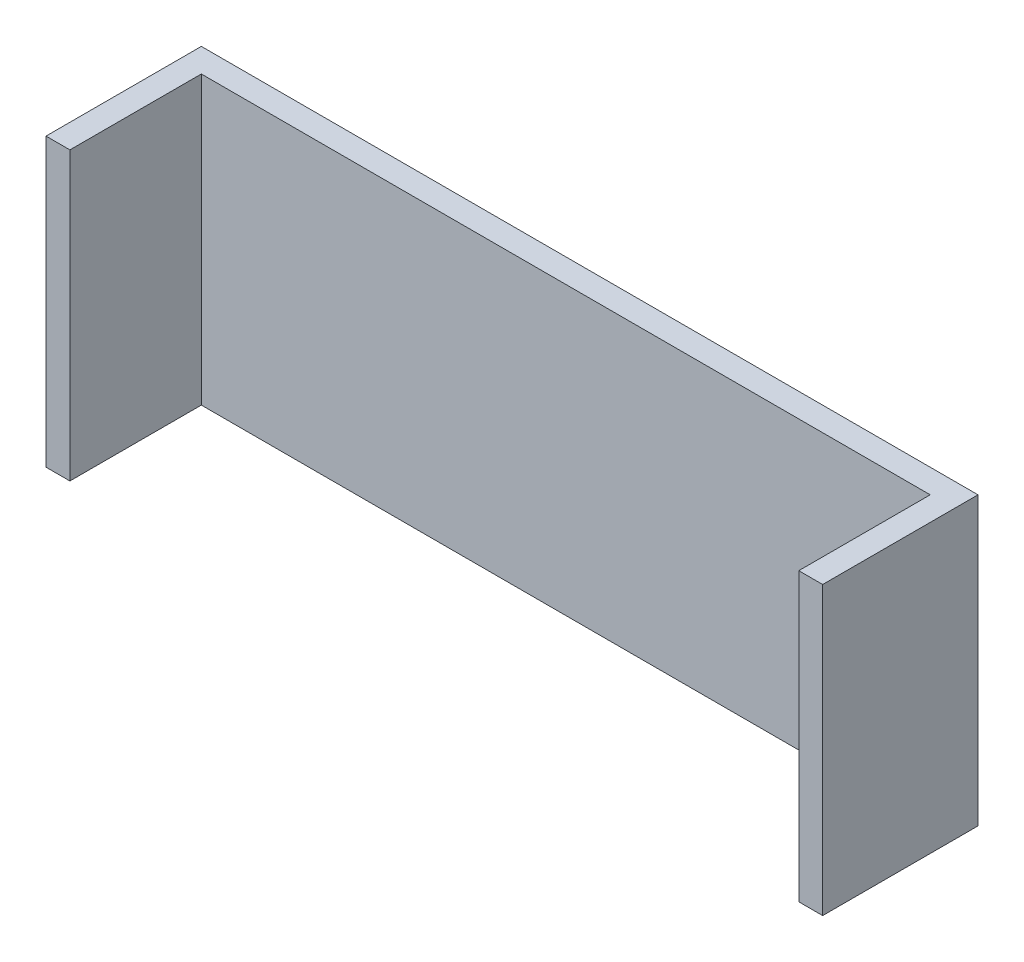
ISO-10303-21;
HEADER;
FILE_DESCRIPTION(('STEP AP214'),'2;1');
FILE_NAME('part.step','',(''),(''),'','','');
FILE_SCHEMA(('AUTOMOTIVE_DESIGN { 1 0 10303 214 1 1 1 1 }'));
ENDSEC;
DATA;
#1=APPLICATION_CONTEXT('core data for automotive mechanical design processes');
#2=APPLICATION_PROTOCOL_DEFINITION('international standard','automotive_design',2000,#1);
#3=PRODUCT_CONTEXT('',#1,'mechanical');
#4=PRODUCT('Part','Part','',(#3));
#5=PRODUCT_RELATED_PRODUCT_CATEGORY('part','',(#4));
#6=PRODUCT_DEFINITION_FORMATION('','',#4);
#7=PRODUCT_DEFINITION_CONTEXT('part definition',#1,'design');
#8=PRODUCT_DEFINITION('design','',#6,#7);
#9=PRODUCT_DEFINITION_SHAPE('','',#8);
#10=(LENGTH_UNIT() NAMED_UNIT(*) SI_UNIT(.MILLI.,.METRE.));
#11=(NAMED_UNIT(*) PLANE_ANGLE_UNIT() SI_UNIT($,.RADIAN.));
#12=(NAMED_UNIT(*) SI_UNIT($,.STERADIAN.) SOLID_ANGLE_UNIT());
#13=UNCERTAINTY_MEASURE_WITH_UNIT(LENGTH_MEASURE(1.E-05),#10,'distance_accuracy_value','');
#14=(GEOMETRIC_REPRESENTATION_CONTEXT(3) GLOBAL_UNCERTAINTY_ASSIGNED_CONTEXT((#13)) GLOBAL_UNIT_ASSIGNED_CONTEXT((#10,
#11,#12)) REPRESENTATION_CONTEXT('',''));
#15=CARTESIAN_POINT('',(0.,0.,0.));
#16=DIRECTION('',(0.,0.,1.));
#17=DIRECTION('',(1.,0.,0.));
#18=AXIS2_PLACEMENT_3D('',#15,#16,#17);
#19=CARTESIAN_POINT('',(0.,0.,13.));
#20=DIRECTION('',(0.,0.,1.));
#21=DIRECTION('',(1.,0.,0.));
#22=AXIS2_PLACEMENT_3D('',#19,#20,#21);
#23=PLANE('',#22);
#24=DIRECTION('',(0.,-1.,0.));
#25=VECTOR('',#24,1.);
#26=CARTESIAN_POINT('',(-63.,24.,13.));
#27=LINE('',#26,#25);
#28=CARTESIAN_POINT('',(-63.,24.,13.));
#29=VERTEX_POINT('',#28);
#30=CARTESIAN_POINT('',(-63.,0.,13.));
#31=VERTEX_POINT('',#30);
#32=EDGE_CURVE('E112',#29,#31,#27,.T.);
#33=ORIENTED_EDGE('',*,*,#32,.F.);
#34=DIRECTION('',(-1.,0.,0.));
#35=VECTOR('',#34,1.);
#36=CARTESIAN_POINT('',(0.,24.,13.));
#37=LINE('',#36,#35);
#38=CARTESIAN_POINT('',(-65.,24.,13.));
#39=VERTEX_POINT('',#38);
#40=EDGE_CURVE('E143',#29,#39,#37,.T.);
#41=ORIENTED_EDGE('',*,*,#40,.T.);
#42=DIRECTION('',(0.,-1.,0.));
#43=VECTOR('',#42,1.);
#44=CARTESIAN_POINT('',(-65.,0.,13.));
#45=LINE('',#44,#43);
#46=CARTESIAN_POINT('',(-65.,0.,13.));
#47=VERTEX_POINT('',#46);
#48=EDGE_CURVE('E145',#39,#47,#45,.T.);
#49=ORIENTED_EDGE('',*,*,#48,.T.);
#50=DIRECTION('',(1.,0.,0.));
#51=VECTOR('',#50,1.);
#52=CARTESIAN_POINT('',(0.,0.,13.));
#53=LINE('',#52,#51);
#54=EDGE_CURVE('E147',#47,#31,#53,.T.);
#55=ORIENTED_EDGE('',*,*,#54,.T.);
#56=EDGE_LOOP('',(#33,#41,#49,#55));
#57=FACE_BOUND('',#56,.T.);
#58=ADVANCED_FACE('F32',(#57),#23,.T.);
#59=CARTESIAN_POINT('',(0.,0.,13.));
#60=DIRECTION('',(-1.,0.,0.));
#61=DIRECTION('',(0.,-1.,0.));
#62=AXIS2_PLACEMENT_3D('',#59,#60,#61);
#63=PLANE('',#62);
#64=DIRECTION('',(0.,1.,0.));
#65=VECTOR('',#64,1.);
#66=CARTESIAN_POINT('',(0.,0.,0.));
#67=LINE('',#66,#65);
#68=CARTESIAN_POINT('',(0.,0.,0.));
#69=VERTEX_POINT('',#68);
#70=CARTESIAN_POINT('',(0.,24.,0.));
#71=VERTEX_POINT('',#70);
#72=EDGE_CURVE('E137',#69,#71,#67,.T.);
#73=ORIENTED_EDGE('',*,*,#72,.T.);
#74=DIRECTION('',(0.,0.,-1.));
#75=VECTOR('',#74,1.);
#76=CARTESIAN_POINT('',(0.,24.,13.));
#77=LINE('',#76,#75);
#78=CARTESIAN_POINT('',(0.,24.,13.));
#79=VERTEX_POINT('',#78);
#80=EDGE_CURVE('E11',#79,#71,#77,.T.);
#81=ORIENTED_EDGE('',*,*,#80,.F.);
#82=DIRECTION('',(0.,1.,0.));
#83=VECTOR('',#82,1.);
#84=CARTESIAN_POINT('',(0.,0.,13.));
#85=LINE('',#84,#83);
#86=CARTESIAN_POINT('',(0.,0.,13.));
#87=VERTEX_POINT('',#86);
#88=EDGE_CURVE('E141',#87,#79,#85,.T.);
#89=ORIENTED_EDGE('',*,*,#88,.F.);
#90=DIRECTION('',(0.,0.,-1.));
#91=VECTOR('',#90,1.);
#92=CARTESIAN_POINT('',(0.,0.,13.));
#93=LINE('',#92,#91);
#94=EDGE_CURVE('E149',#87,#69,#93,.T.);
#95=ORIENTED_EDGE('',*,*,#94,.T.);
#96=EDGE_LOOP('',(#73,#81,#89,#95));
#97=FACE_BOUND('',#96,.T.);
#98=ADVANCED_FACE('F34',(#97),#63,.F.);
#99=CARTESIAN_POINT('',(0.,24.,13.));
#100=DIRECTION('',(0.,-1.,0.));
#101=DIRECTION('',(1.,0.,0.));
#102=AXIS2_PLACEMENT_3D('',#99,#100,#101);
#103=PLANE('',#102);
#104=ORIENTED_EDGE('',*,*,#40,.F.);
#105=DIRECTION('',(0.,0.,1.));
#106=VECTOR('',#105,1.);
#107=CARTESIAN_POINT('',(-63.,24.,2.));
#108=LINE('',#107,#106);
#109=CARTESIAN_POINT('',(-63.,24.,2.));
#110=VERTEX_POINT('',#109);
#111=EDGE_CURVE('E135',#110,#29,#108,.T.);
#112=ORIENTED_EDGE('',*,*,#111,.F.);
#113=DIRECTION('',(-1.,0.,0.));
#114=VECTOR('',#113,1.);
#115=CARTESIAN_POINT('',(-63.,24.,2.));
#116=LINE('',#115,#114);
#117=CARTESIAN_POINT('',(-2.,24.,2.));
#118=VERTEX_POINT('',#117);
#119=EDGE_CURVE('E116',#118,#110,#116,.T.);
#120=ORIENTED_EDGE('',*,*,#119,.F.);
#121=DIRECTION('',(0.,0.,1.));
#122=VECTOR('',#121,1.);
#123=CARTESIAN_POINT('',(-2.,24.,2.));
#124=LINE('',#123,#122);
#125=CARTESIAN_POINT('',(-2.,24.,13.));
#126=VERTEX_POINT('',#125);
#127=EDGE_CURVE('E138',#118,#126,#124,.T.);
#128=ORIENTED_EDGE('',*,*,#127,.T.);
#129=EDGE_CURVE('E84',#79,#126,#37,.T.);
#130=ORIENTED_EDGE('',*,*,#129,.F.);
#131=ORIENTED_EDGE('',*,*,#80,.T.);
#132=DIRECTION('',(-1.,0.,0.));
#133=VECTOR('',#132,1.);
#134=CARTESIAN_POINT('',(0.,24.,0.));
#135=LINE('',#134,#133);
#136=CARTESIAN_POINT('',(-65.,24.,0.));
#137=VERTEX_POINT('',#136);
#138=EDGE_CURVE('E152',#71,#137,#135,.T.);
#139=ORIENTED_EDGE('',*,*,#138,.T.);
#140=DIRECTION('',(0.,0.,-1.));
#141=VECTOR('',#140,1.);
#142=CARTESIAN_POINT('',(-65.,24.,13.));
#143=LINE('',#142,#141);
#144=EDGE_CURVE('E40',#39,#137,#143,.T.);
#145=ORIENTED_EDGE('',*,*,#144,.F.);
#146=EDGE_LOOP('',(#104,#112,#120,#128,#130,#131,#139,#145));
#147=FACE_BOUND('',#146,.T.);
#148=ADVANCED_FACE('F175',(#147),#103,.F.);
#149=CARTESIAN_POINT('',(-65.,0.,13.));
#150=DIRECTION('',(1.,0.,0.));
#151=DIRECTION('',(0.,0.,-1.));
#152=AXIS2_PLACEMENT_3D('',#149,#150,#151);
#153=PLANE('',#152);
#154=DIRECTION('',(0.,-1.,0.));
#155=VECTOR('',#154,1.);
#156=CARTESIAN_POINT('',(-65.,0.,0.));
#157=LINE('',#156,#155);
#158=CARTESIAN_POINT('',(-65.,0.,0.));
#159=VERTEX_POINT('',#158);
#160=EDGE_CURVE('E154',#137,#159,#157,.T.);
#161=ORIENTED_EDGE('',*,*,#160,.T.);
#162=DIRECTION('',(0.,0.,-1.));
#163=VECTOR('',#162,1.);
#164=CARTESIAN_POINT('',(-65.,0.,13.));
#165=LINE('',#164,#163);
#166=EDGE_CURVE('E158',#47,#159,#165,.T.);
#167=ORIENTED_EDGE('',*,*,#166,.F.);
#168=ORIENTED_EDGE('',*,*,#48,.F.);
#169=ORIENTED_EDGE('',*,*,#144,.T.);
#170=EDGE_LOOP('',(#161,#167,#168,#169));
#171=FACE_BOUND('',#170,.T.);
#172=ADVANCED_FACE('F164',(#171),#153,.F.);
#173=CARTESIAN_POINT('',(0.,0.,13.));
#174=DIRECTION('',(0.,1.,0.));
#175=DIRECTION('',(0.,0.,1.));
#176=AXIS2_PLACEMENT_3D('',#173,#174,#175);
#177=PLANE('',#176);
#178=DIRECTION('',(1.,0.,0.));
#179=VECTOR('',#178,1.);
#180=CARTESIAN_POINT('',(-63.,0.,2.));
#181=LINE('',#180,#179);
#182=CARTESIAN_POINT('',(-63.,0.,2.));
#183=VERTEX_POINT('',#182);
#184=CARTESIAN_POINT('',(-2.,0.,2.));
#185=VERTEX_POINT('',#184);
#186=EDGE_CURVE('E122',#183,#185,#181,.T.);
#187=ORIENTED_EDGE('',*,*,#186,.F.);
#188=DIRECTION('',(0.,0.,1.));
#189=VECTOR('',#188,1.);
#190=CARTESIAN_POINT('',(-63.,0.,2.));
#191=LINE('',#190,#189);
#192=EDGE_CURVE('E106',#183,#31,#191,.T.);
#193=ORIENTED_EDGE('',*,*,#192,.T.);
#194=ORIENTED_EDGE('',*,*,#54,.F.);
#195=ORIENTED_EDGE('',*,*,#166,.T.);
#196=DIRECTION('',(1.,0.,0.));
#197=VECTOR('',#196,1.);
#198=CARTESIAN_POINT('',(0.,0.,0.));
#199=LINE('',#198,#197);
#200=EDGE_CURVE('E77',#159,#69,#199,.T.);
#201=ORIENTED_EDGE('',*,*,#200,.T.);
#202=ORIENTED_EDGE('',*,*,#94,.F.);
#203=CARTESIAN_POINT('',(-2.,0.,13.));
#204=VERTEX_POINT('',#203);
#205=EDGE_CURVE('E55',#204,#87,#53,.T.);
#206=ORIENTED_EDGE('',*,*,#205,.F.);
#207=DIRECTION('',(0.,0.,1.));
#208=VECTOR('',#207,1.);
#209=CARTESIAN_POINT('',(-2.,0.,2.));
#210=LINE('',#209,#208);
#211=EDGE_CURVE('E47',#185,#204,#210,.T.);
#212=ORIENTED_EDGE('',*,*,#211,.F.);
#213=EDGE_LOOP('',(#187,#193,#194,#195,#201,#202,#206,#212));
#214=FACE_BOUND('',#213,.T.);
#215=ADVANCED_FACE('F127',(#214),#177,.F.);
#216=DIRECTION('',(0.,1.,0.));
#217=VECTOR('',#216,1.);
#218=CARTESIAN_POINT('',(-2.,24.,13.));
#219=LINE('',#218,#217);
#220=EDGE_CURVE('E125',#204,#126,#219,.T.);
#221=ORIENTED_EDGE('',*,*,#220,.F.);
#222=ORIENTED_EDGE('',*,*,#205,.T.);
#223=ORIENTED_EDGE('',*,*,#88,.T.);
#224=ORIENTED_EDGE('',*,*,#129,.T.);
#225=EDGE_LOOP('',(#221,#222,#223,#224));
#226=FACE_BOUND('',#225,.T.);
#227=ADVANCED_FACE('F173',(#226),#23,.T.);
#228=CARTESIAN_POINT('',(0.,0.,0.));
#229=DIRECTION('',(0.,0.,1.));
#230=DIRECTION('',(1.,0.,0.));
#231=AXIS2_PLACEMENT_3D('',#228,#229,#230);
#232=PLANE('',#231);
#233=ORIENTED_EDGE('',*,*,#72,.F.);
#234=ORIENTED_EDGE('',*,*,#200,.F.);
#235=ORIENTED_EDGE('',*,*,#160,.F.);
#236=ORIENTED_EDGE('',*,*,#138,.F.);
#237=EDGE_LOOP('',(#233,#234,#235,#236));
#238=FACE_BOUND('',#237,.T.);
#239=ADVANCED_FACE('F169',(#238),#232,.F.);
#240=CARTESIAN_POINT('',(-63.,24.,2.));
#241=DIRECTION('',(-1.,0.,0.));
#242=DIRECTION('',(0.,0.,1.));
#243=AXIS2_PLACEMENT_3D('',#240,#241,#242);
#244=PLANE('',#243);
#245=ORIENTED_EDGE('',*,*,#32,.T.);
#246=ORIENTED_EDGE('',*,*,#192,.F.);
#247=DIRECTION('',(0.,-1.,0.));
#248=VECTOR('',#247,1.);
#249=CARTESIAN_POINT('',(-63.,24.,2.));
#250=LINE('',#249,#248);
#251=EDGE_CURVE('E109',#110,#183,#250,.T.);
#252=ORIENTED_EDGE('',*,*,#251,.F.);
#253=ORIENTED_EDGE('',*,*,#111,.T.);
#254=EDGE_LOOP('',(#245,#246,#252,#253));
#255=FACE_BOUND('',#254,.T.);
#256=ADVANCED_FACE('F108',(#255),#244,.F.);
#257=CARTESIAN_POINT('',(-2.,24.,2.));
#258=DIRECTION('',(1.,0.,0.));
#259=DIRECTION('',(0.,0.,-1.));
#260=AXIS2_PLACEMENT_3D('',#257,#258,#259);
#261=PLANE('',#260);
#262=ORIENTED_EDGE('',*,*,#220,.T.);
#263=ORIENTED_EDGE('',*,*,#127,.F.);
#264=DIRECTION('',(0.,1.,0.));
#265=VECTOR('',#264,1.);
#266=CARTESIAN_POINT('',(-2.,24.,2.));
#267=LINE('',#266,#265);
#268=EDGE_CURVE('E128',#185,#118,#267,.T.);
#269=ORIENTED_EDGE('',*,*,#268,.F.);
#270=ORIENTED_EDGE('',*,*,#211,.T.);
#271=EDGE_LOOP('',(#262,#263,#269,#270));
#272=FACE_BOUND('',#271,.T.);
#273=ADVANCED_FACE('F174',(#272),#261,.F.);
#274=CARTESIAN_POINT('',(0.,0.,2.));
#275=DIRECTION('',(0.,0.,1.));
#276=DIRECTION('',(1.,0.,0.));
#277=AXIS2_PLACEMENT_3D('',#274,#275,#276);
#278=PLANE('',#277);
#279=ORIENTED_EDGE('',*,*,#251,.T.);
#280=ORIENTED_EDGE('',*,*,#186,.T.);
#281=ORIENTED_EDGE('',*,*,#268,.T.);
#282=ORIENTED_EDGE('',*,*,#119,.T.);
#283=EDGE_LOOP('',(#279,#280,#281,#282));
#284=FACE_BOUND('',#283,.T.);
#285=ADVANCED_FACE('F120',(#284),#278,.T.);
#286=CLOSED_SHELL('',(#58,#98,#148,#172,#215,#227,#239,#256,#273,#285));
#287=MANIFOLD_SOLID_BREP('B2',#286);
#288=ADVANCED_BREP_SHAPE_REPRESENTATION('',(#18,#287),#14);
#289=SHAPE_DEFINITION_REPRESENTATION(#9,#288);
ENDSEC;
END-ISO-10303-21;
